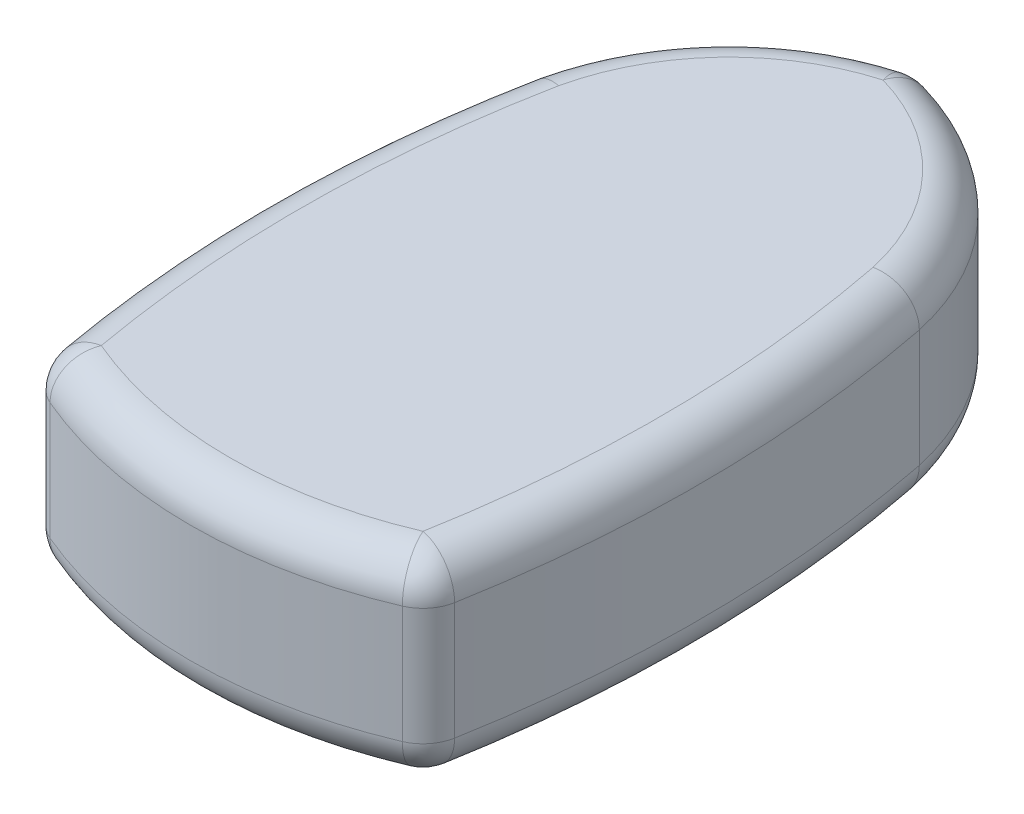
ISO-10303-21;
HEADER;
FILE_DESCRIPTION(('STEP AP214'),'2;1');
FILE_NAME('part.step','',(''),(''),'','','');
FILE_SCHEMA(('AUTOMOTIVE_DESIGN { 1 0 10303 214 1 1 1 1 }'));
ENDSEC;
DATA;
#1=APPLICATION_CONTEXT('core data for automotive mechanical design processes');
#2=APPLICATION_PROTOCOL_DEFINITION('international standard','automotive_design',2000,#1);
#3=PRODUCT_CONTEXT('',#1,'mechanical');
#4=PRODUCT('Part','Part','',(#3));
#5=PRODUCT_RELATED_PRODUCT_CATEGORY('part','',(#4));
#6=PRODUCT_DEFINITION_FORMATION('','',#4);
#7=PRODUCT_DEFINITION_CONTEXT('part definition',#1,'design');
#8=PRODUCT_DEFINITION('design','',#6,#7);
#9=PRODUCT_DEFINITION_SHAPE('','',#8);
#10=(LENGTH_UNIT() NAMED_UNIT(*) SI_UNIT(.MILLI.,.METRE.));
#11=(NAMED_UNIT(*) PLANE_ANGLE_UNIT() SI_UNIT($,.RADIAN.));
#12=(NAMED_UNIT(*) SI_UNIT($,.STERADIAN.) SOLID_ANGLE_UNIT());
#13=UNCERTAINTY_MEASURE_WITH_UNIT(LENGTH_MEASURE(1.E-05),#10,'distance_accuracy_value','');
#14=(GEOMETRIC_REPRESENTATION_CONTEXT(3) GLOBAL_UNCERTAINTY_ASSIGNED_CONTEXT((#13)) GLOBAL_UNIT_ASSIGNED_CONTEXT((#10,
#11,#12)) REPRESENTATION_CONTEXT('',''));
#15=CARTESIAN_POINT('',(0.,0.,0.));
#16=DIRECTION('',(0.,0.,1.));
#17=DIRECTION('',(1.,0.,0.));
#18=AXIS2_PLACEMENT_3D('',#15,#16,#17);
#19=CARTESIAN_POINT('',(25.4,25.4,-52.6092805501083));
#20=DIRECTION('',(0.,-1.,0.));
#21=DIRECTION('',(0.,0.,-1.));
#22=AXIS2_PLACEMENT_3D('',#19,#20,#21);
#23=CYLINDRICAL_SURFACE('',#22,58.42);
#24=CARTESIAN_POINT('',(25.4,5.08,-52.6092805501083));
#25=DIRECTION('',(0.,1.,0.));
#26=DIRECTION('',(0.,0.,1.));
#27=AXIS2_PLACEMENT_3D('',#24,#25,#26);
#28=CIRCLE('',#27,58.42);
#29=CARTESIAN_POINT('',(2.5161214205725,5.08,1.1422264163203));
#30=VERTEX_POINT('',#29);
#31=CARTESIAN_POINT('',(48.2838785794275,5.08,1.14222641632032));
#32=VERTEX_POINT('',#31);
#33=EDGE_CURVE('E224',#30,#32,#28,.T.);
#34=ORIENTED_EDGE('',*,*,#33,.T.);
#35=DIRECTION('',(0.,-1.,0.));
#36=VECTOR('',#35,1.);
#37=CARTESIAN_POINT('',(48.2838785794275,25.4,1.14222641632032));
#38=LINE('',#37,#36);
#39=CARTESIAN_POINT('',(48.2838785794275,20.32,1.14222641632032));
#40=VERTEX_POINT('',#39);
#41=EDGE_CURVE('E228',#32,#40,#38,.F.);
#42=ORIENTED_EDGE('',*,*,#41,.T.);
#43=CARTESIAN_POINT('',(25.4,20.32,-52.6092805501083));
#44=DIRECTION('',(0.,1.,0.));
#45=DIRECTION('',(0.,0.,1.));
#46=AXIS2_PLACEMENT_3D('',#43,#44,#45);
#47=CIRCLE('',#46,58.42);
#48=CARTESIAN_POINT('',(2.5161214205725,20.32,1.1422264163203));
#49=VERTEX_POINT('',#48);
#50=EDGE_CURVE('E221',#40,#49,#47,.F.);
#51=ORIENTED_EDGE('',*,*,#50,.T.);
#52=DIRECTION('',(0.,-1.,0.));
#53=VECTOR('',#52,1.);
#54=CARTESIAN_POINT('',(2.5161214205725,25.4,1.14222641632031));
#55=LINE('',#54,#53);
#56=EDGE_CURVE('E218',#49,#30,#55,.T.);
#57=ORIENTED_EDGE('',*,*,#56,.T.);
#58=EDGE_LOOP('',(#34,#42,#51,#57));
#59=FACE_BOUND('',#58,.T.);
#60=ADVANCED_FACE('F39',(#59),#23,.T.);
#61=CARTESIAN_POINT('',(-111.218355441598,25.4,-31.75));
#62=DIRECTION('',(0.,-1.,0.));
#63=DIRECTION('',(0.,0.,-1.));
#64=AXIS2_PLACEMENT_3D('',#61,#62,#63);
#65=CYLINDRICAL_SURFACE('',#64,165.1);
#66=DIRECTION('',(0.,-1.,0.));
#67=VECTOR('',#66,1.);
#68=CARTESIAN_POINT('',(51.2943675715887,25.4,-2.63600235558096));
#69=LINE('',#68,#67);
#70=CARTESIAN_POINT('',(51.2943675715887,20.32,-2.63600235558097));
#71=VERTEX_POINT('',#70);
#72=CARTESIAN_POINT('',(51.2943675715887,5.08,-2.63600235558097));
#73=VERTEX_POINT('',#72);
#74=EDGE_CURVE('E156',#71,#73,#69,.T.);
#75=ORIENTED_EDGE('',*,*,#74,.T.);
#76=CARTESIAN_POINT('',(-111.218355441598,5.08,-31.75));
#77=DIRECTION('',(0.,1.,0.));
#78=DIRECTION('',(0.,0.,1.));
#79=AXIS2_PLACEMENT_3D('',#76,#77,#78);
#80=CIRCLE('',#79,165.1);
#81=CARTESIAN_POINT('',(50.8,5.08,-63.5));
#82=VERTEX_POINT('',#81);
#83=EDGE_CURVE('E154',#73,#82,#80,.T.);
#84=ORIENTED_EDGE('',*,*,#83,.T.);
#85=DIRECTION('',(0.,-1.,0.));
#86=VECTOR('',#85,1.);
#87=CARTESIAN_POINT('',(50.8,25.4,-63.5));
#88=LINE('',#87,#86);
#89=CARTESIAN_POINT('',(50.8,20.32,-63.5));
#90=VERTEX_POINT('',#89);
#91=EDGE_CURVE('E137',#90,#82,#88,.T.);
#92=ORIENTED_EDGE('',*,*,#91,.F.);
#93=CARTESIAN_POINT('',(-111.218355441598,20.32,-31.75));
#94=DIRECTION('',(0.,1.,0.));
#95=DIRECTION('',(0.,0.,1.));
#96=AXIS2_PLACEMENT_3D('',#93,#94,#95);
#97=CIRCLE('',#96,165.1);
#98=EDGE_CURVE('E151',#90,#71,#97,.F.);
#99=ORIENTED_EDGE('',*,*,#98,.T.);
#100=EDGE_LOOP('',(#75,#84,#92,#99));
#101=FACE_BOUND('',#100,.T.);
#102=ADVANCED_FACE('F149',(#101),#65,.T.);
#103=CARTESIAN_POINT('',(17.3144267169768,25.4,-56.1162013903898));
#104=DIRECTION('',(0.,-1.,0.));
#105=DIRECTION('',(0.,0.,-1.));
#106=AXIS2_PLACEMENT_3D('',#103,#104,#105);
#107=CYLINDRICAL_SURFACE('',#106,34.29);
#108=ORIENTED_EDGE('',*,*,#91,.T.);
#109=CARTESIAN_POINT('',(17.3144267169768,5.08,-56.1162013903898));
#110=DIRECTION('',(0.,1.,0.));
#111=DIRECTION('',(0.,0.,1.));
#112=AXIS2_PLACEMENT_3D('',#109,#110,#111);
#113=CIRCLE('',#112,34.29);
#114=CARTESIAN_POINT('',(26.8061866579171,5.08,-89.0663242008372));
#115=VERTEX_POINT('',#114);
#116=EDGE_CURVE('E145',#82,#115,#113,.T.);
#117=ORIENTED_EDGE('',*,*,#116,.T.);
#118=DIRECTION('',(0.,-1.,0.));
#119=VECTOR('',#118,1.);
#120=CARTESIAN_POINT('',(26.8061866579171,25.4,-89.0663242008372));
#121=LINE('',#120,#119);
#122=CARTESIAN_POINT('',(26.8061866579171,20.32,-89.0663242008372));
#123=VERTEX_POINT('',#122);
#124=EDGE_CURVE('E139',#115,#123,#121,.F.);
#125=ORIENTED_EDGE('',*,*,#124,.T.);
#126=CARTESIAN_POINT('',(17.3144267169768,20.32,-56.1162013903898));
#127=DIRECTION('',(0.,1.,0.));
#128=DIRECTION('',(0.,0.,1.));
#129=AXIS2_PLACEMENT_3D('',#126,#127,#128);
#130=CIRCLE('',#129,34.29);
#131=EDGE_CURVE('E134',#123,#90,#130,.F.);
#132=ORIENTED_EDGE('',*,*,#131,.T.);
#133=EDGE_LOOP('',(#108,#117,#125,#132));
#134=FACE_BOUND('',#133,.T.);
#135=ADVANCED_FACE('F136',(#134),#107,.T.);
#136=CARTESIAN_POINT('',(33.4855732830232,25.4,-56.1162013903898));
#137=DIRECTION('',(0.,-1.,0.));
#138=DIRECTION('',(0.,0.,-1.));
#139=AXIS2_PLACEMENT_3D('',#136,#137,#138);
#140=CYLINDRICAL_SURFACE('',#139,34.29);
#141=DIRECTION('',(0.,-1.,0.));
#142=VECTOR('',#141,1.);
#143=CARTESIAN_POINT('',(23.9938133420829,25.4,-89.0663242008372));
#144=LINE('',#143,#142);
#145=CARTESIAN_POINT('',(23.9938133420829,20.32,-89.0663242008372));
#146=VERTEX_POINT('',#145);
#147=CARTESIAN_POINT('',(23.9938133420829,5.08,-89.0663242008372));
#148=VERTEX_POINT('',#147);
#149=EDGE_CURVE('E199',#146,#148,#144,.T.);
#150=ORIENTED_EDGE('',*,*,#149,.T.);
#151=CARTESIAN_POINT('',(33.4855732830232,5.08,-56.1162013903898));
#152=DIRECTION('',(0.,1.,0.));
#153=DIRECTION('',(0.,0.,1.));
#154=AXIS2_PLACEMENT_3D('',#151,#152,#153);
#155=CIRCLE('',#154,34.29);
#156=CARTESIAN_POINT('',(0.,5.08,-63.4999999999999));
#157=VERTEX_POINT('',#156);
#158=EDGE_CURVE('E205',#148,#157,#155,.T.);
#159=ORIENTED_EDGE('',*,*,#158,.T.);
#160=DIRECTION('',(0.,-1.,0.));
#161=VECTOR('',#160,1.);
#162=CARTESIAN_POINT('',(0.,25.4,-63.4999999999999));
#163=LINE('',#162,#161);
#164=CARTESIAN_POINT('',(0.,20.32,-63.4999999999999));
#165=VERTEX_POINT('',#164);
#166=EDGE_CURVE('E157',#165,#157,#163,.T.);
#167=ORIENTED_EDGE('',*,*,#166,.F.);
#168=CARTESIAN_POINT('',(33.4855732830232,20.32,-56.1162013903898));
#169=DIRECTION('',(0.,1.,0.));
#170=DIRECTION('',(0.,0.,1.));
#171=AXIS2_PLACEMENT_3D('',#168,#169,#170);
#172=CIRCLE('',#171,34.29);
#173=EDGE_CURVE('E202',#165,#146,#172,.F.);
#174=ORIENTED_EDGE('',*,*,#173,.T.);
#175=EDGE_LOOP('',(#150,#159,#167,#174));
#176=FACE_BOUND('',#175,.T.);
#177=ADVANCED_FACE('F426',(#176),#140,.T.);
#178=CARTESIAN_POINT('',(162.018355441598,25.4,-31.75));
#179=DIRECTION('',(0.,-1.,0.));
#180=DIRECTION('',(0.,0.,-1.));
#181=AXIS2_PLACEMENT_3D('',#178,#179,#180);
#182=CYLINDRICAL_SURFACE('',#181,165.1);
#183=ORIENTED_EDGE('',*,*,#166,.T.);
#184=CARTESIAN_POINT('',(162.018355441598,5.08,-31.75));
#185=DIRECTION('',(0.,1.,0.));
#186=DIRECTION('',(0.,0.,1.));
#187=AXIS2_PLACEMENT_3D('',#184,#185,#186);
#188=CIRCLE('',#187,165.1);
#189=CARTESIAN_POINT('',(-0.494367571588713,5.08,-2.63600235558099));
#190=VERTEX_POINT('',#189);
#191=EDGE_CURVE('E215',#157,#190,#188,.T.);
#192=ORIENTED_EDGE('',*,*,#191,.T.);
#193=DIRECTION('',(0.,-1.,0.));
#194=VECTOR('',#193,1.);
#195=CARTESIAN_POINT('',(-0.494367571588744,25.4,-2.63600235558099));
#196=LINE('',#195,#194);
#197=CARTESIAN_POINT('',(-0.494367571588713,20.32,-2.63600235558099));
#198=VERTEX_POINT('',#197);
#199=EDGE_CURVE('E209',#190,#198,#196,.F.);
#200=ORIENTED_EDGE('',*,*,#199,.T.);
#201=CARTESIAN_POINT('',(162.018355441598,20.32,-31.75));
#202=DIRECTION('',(0.,1.,0.));
#203=DIRECTION('',(0.,0.,1.));
#204=AXIS2_PLACEMENT_3D('',#201,#202,#203);
#205=CIRCLE('',#204,165.1);
#206=EDGE_CURVE('E212',#198,#165,#205,.F.);
#207=ORIENTED_EDGE('',*,*,#206,.T.);
#208=EDGE_LOOP('',(#183,#192,#200,#207));
#209=FACE_BOUND('',#208,.T.);
#210=ADVANCED_FACE('F429',(#209),#182,.T.);
#211=CARTESIAN_POINT('',(-42.909177720799,25.4,-42.1796402750541));
#212=DIRECTION('',(0.,1.,0.));
#213=DIRECTION('',(0.,0.,1.));
#214=AXIS2_PLACEMENT_3D('',#211,#212,#213);
#215=PLANE('',#214);
#216=CARTESIAN_POINT('',(33.4855732830232,25.4,-56.1162013903898));
#217=DIRECTION('',(0.,1.,0.));
#218=DIRECTION('',(0.,0.,1.));
#219=AXIS2_PLACEMENT_3D('',#216,#217,#218);
#220=CIRCLE('',#219,29.21);
#221=CARTESIAN_POINT('',(25.4,25.4,-84.1848245252153));
#222=VERTEX_POINT('',#221);
#223=CARTESIAN_POINT('',(4.97333168382862,25.4,-62.4625530186213));
#224=VERTEX_POINT('',#223);
#225=EDGE_CURVE('E49',#222,#224,#220,.T.);
#226=ORIENTED_EDGE('',*,*,#225,.T.);
#227=CARTESIAN_POINT('',(162.018355441598,25.4,-31.75));
#228=DIRECTION('',(0.,1.,0.));
#229=DIRECTION('',(0.,0.,1.));
#230=AXIS2_PLACEMENT_3D('',#227,#228,#229);
#231=CIRCLE('',#230,160.02);
#232=CARTESIAN_POINT('',(4.50602390574011,25.4,-3.53181766771696));
#233=VERTEX_POINT('',#232);
#234=EDGE_CURVE('E11',#224,#233,#231,.T.);
#235=ORIENTED_EDGE('',*,*,#234,.T.);
#236=CARTESIAN_POINT('',(25.4,25.4,-52.6092805501083));
#237=DIRECTION('',(0.,1.,0.));
#238=DIRECTION('',(0.,0.,1.));
#239=AXIS2_PLACEMENT_3D('',#236,#237,#238);
#240=CIRCLE('',#239,53.34);
#241=CARTESIAN_POINT('',(46.2939760942599,25.4,-3.53181766771697));
#242=VERTEX_POINT('',#241);
#243=EDGE_CURVE('E231',#233,#242,#240,.T.);
#244=ORIENTED_EDGE('',*,*,#243,.T.);
#245=CARTESIAN_POINT('',(-111.218355441598,25.4,-31.75));
#246=DIRECTION('',(0.,1.,0.));
#247=DIRECTION('',(0.,0.,1.));
#248=AXIS2_PLACEMENT_3D('',#245,#246,#247);
#249=CIRCLE('',#248,160.02);
#250=CARTESIAN_POINT('',(45.8266683161713,25.4,-62.4625530186218));
#251=VERTEX_POINT('',#250);
#252=EDGE_CURVE('E234',#242,#251,#249,.T.);
#253=ORIENTED_EDGE('',*,*,#252,.T.);
#254=CARTESIAN_POINT('',(17.3144267169768,25.4,-56.1162013903898));
#255=DIRECTION('',(0.,1.,0.));
#256=DIRECTION('',(0.,0.,1.));
#257=AXIS2_PLACEMENT_3D('',#254,#255,#256);
#258=CIRCLE('',#257,29.21);
#259=EDGE_CURVE('E60',#251,#222,#258,.T.);
#260=ORIENTED_EDGE('',*,*,#259,.T.);
#261=EDGE_LOOP('',(#226,#235,#244,#253,#260));
#262=FACE_BOUND('',#261,.T.);
#263=ADVANCED_FACE('F455',(#262),#215,.T.);
#264=CARTESIAN_POINT('',(-42.909177720799,0.,-42.1796402750541));
#265=DIRECTION('',(0.,1.,0.));
#266=DIRECTION('',(0.,0.,1.));
#267=AXIS2_PLACEMENT_3D('',#264,#265,#266);
#268=PLANE('',#267);
#269=CARTESIAN_POINT('',(17.3144267169768,0.,-56.1162013903898));
#270=DIRECTION('',(0.,1.,0.));
#271=DIRECTION('',(0.,0.,1.));
#272=AXIS2_PLACEMENT_3D('',#269,#270,#271);
#273=CIRCLE('',#272,29.21);
#274=CARTESIAN_POINT('',(25.4,0.,-84.1848245252153));
#275=VERTEX_POINT('',#274);
#276=CARTESIAN_POINT('',(45.8266683161713,0.,-62.4625530186217));
#277=VERTEX_POINT('',#276);
#278=EDGE_CURVE('E188',#275,#277,#273,.F.);
#279=ORIENTED_EDGE('',*,*,#278,.T.);
#280=CARTESIAN_POINT('',(-111.218355441598,0.,-31.75));
#281=DIRECTION('',(0.,1.,0.));
#282=DIRECTION('',(0.,0.,1.));
#283=AXIS2_PLACEMENT_3D('',#280,#281,#282);
#284=CIRCLE('',#283,160.02);
#285=CARTESIAN_POINT('',(46.2939760942599,0.,-3.53181766771697));
#286=VERTEX_POINT('',#285);
#287=EDGE_CURVE('E191',#277,#286,#284,.F.);
#288=ORIENTED_EDGE('',*,*,#287,.T.);
#289=CARTESIAN_POINT('',(25.4,0.,-52.6092805501083));
#290=DIRECTION('',(0.,1.,0.));
#291=DIRECTION('',(0.,0.,1.));
#292=AXIS2_PLACEMENT_3D('',#289,#290,#291);
#293=CIRCLE('',#292,53.34);
#294=CARTESIAN_POINT('',(4.50602390574011,0.,-3.53181766771696));
#295=VERTEX_POINT('',#294);
#296=EDGE_CURVE('E176',#286,#295,#293,.F.);
#297=ORIENTED_EDGE('',*,*,#296,.T.);
#298=CARTESIAN_POINT('',(162.018355441598,0.,-31.75));
#299=DIRECTION('',(0.,1.,0.));
#300=DIRECTION('',(0.,0.,1.));
#301=AXIS2_PLACEMENT_3D('',#298,#299,#300);
#302=CIRCLE('',#301,160.02);
#303=CARTESIAN_POINT('',(4.97333168382855,0.,-62.4625530186211));
#304=VERTEX_POINT('',#303);
#305=EDGE_CURVE('E182',#295,#304,#302,.F.);
#306=ORIENTED_EDGE('',*,*,#305,.T.);
#307=CARTESIAN_POINT('',(33.4855732830232,0.,-56.1162013903898));
#308=DIRECTION('',(0.,1.,0.));
#309=DIRECTION('',(0.,0.,1.));
#310=AXIS2_PLACEMENT_3D('',#307,#308,#309);
#311=CIRCLE('',#310,29.21);
#312=EDGE_CURVE('E185',#304,#275,#311,.F.);
#313=ORIENTED_EDGE('',*,*,#312,.T.);
#314=EDGE_LOOP('',(#279,#288,#297,#306,#313));
#315=FACE_BOUND('',#314,.T.);
#316=ADVANCED_FACE('F411',(#315),#268,.F.);
#317=CARTESIAN_POINT('',(162.018355441598,20.32,-31.75));
#318=DIRECTION('',(0.,1.,0.));
#319=DIRECTION('',(0.,0.,1.));
#320=AXIS2_PLACEMENT_3D('',#317,#318,#319);
#321=TOROIDAL_SURFACE('',#320,160.02,5.08);
#322=CARTESIAN_POINT('',(4.5060239057401,20.32,-3.53181766771694));
#323=DIRECTION('',(0.176341596877156,0.,0.984329030970241));
#324=DIRECTION('',(0.984329030970242,0.,-0.176341596877156));
#325=AXIS2_PLACEMENT_3D('',#322,#323,#324);
#326=CIRCLE('',#325,5.08);
#327=EDGE_CURVE('E43',#233,#198,#326,.T.);
#328=ORIENTED_EDGE('',*,*,#327,.F.);
#329=ORIENTED_EDGE('',*,*,#234,.F.);
#330=CARTESIAN_POINT('',(0.,20.32,-63.4999999999999));
#331=CARTESIAN_POINT('',(-1.50508630477774E-05,20.4628681093777,-63.5000031013171));
#332=CARTESIAN_POINT('',(0.00590019973921946,20.6057340061103,-63.4987715412028));
#333=CARTESIAN_POINT('',(0.0294825950954693,20.8904436644747,-63.4938614994589));
#334=CARTESIAN_POINT('',(0.0471491761554455,21.0322874748047,-63.490183135199));
#335=CARTESIAN_POINT('',(0.0941093547436546,21.3138520881607,-63.480405253186));
#336=CARTESIAN_POINT('',(0.123394930451582,21.4535742870028,-63.4743074058575));
#337=CARTESIAN_POINT('',(0.193379864353173,21.7300017297115,-63.4597345042007));
#338=CARTESIAN_POINT('',(0.234079083806526,21.866707010229,-63.4512594787684));
#339=CARTESIAN_POINT('',(0.326617220921296,22.1361714427967,-63.4319886879443));
#340=CARTESIAN_POINT('',(0.378459470456608,22.2689294010142,-63.4211922284208));
#341=CARTESIAN_POINT('',(0.492928468384816,22.5295608896241,-63.3973517765342));
#342=CARTESIAN_POINT('',(0.555559181863877,22.657432602987,-63.3843069578303));
#343=CARTESIAN_POINT('',(0.691105737597948,22.9072558519563,-63.356072893054));
#344=CARTESIAN_POINT('',(0.764015430735183,23.0292108688594,-63.3408849290547));
#345=CARTESIAN_POINT('',(0.919656781250289,23.2664571513926,-63.308460036234));
#346=CARTESIAN_POINT('',(1.00239184312959,23.3817460865228,-63.2912223971953));
#347=CARTESIAN_POINT('',(1.17705785537819,23.6047727241403,-63.2548274705111));
#348=CARTESIAN_POINT('',(1.26898699047674,23.7125119101285,-63.2356705618035));
#349=CARTESIAN_POINT('',(1.46140106780738,23.9196985539233,-63.1955692844729));
#350=CARTESIAN_POINT('',(1.561886011667,24.0191460101526,-63.1746249155098));
#351=CARTESIAN_POINT('',(1.770751257801,24.2090917434299,-63.1310851281759));
#352=CARTESIAN_POINT('',(1.87913561108637,24.2995853718537,-63.1084888626536));
#353=CARTESIAN_POINT('',(2.10294346514759,24.4708917302356,-63.0618225120339));
#354=CARTESIAN_POINT('',(2.21836450945542,24.5517078096958,-63.0377529412471));
#355=CARTESIAN_POINT('',(2.45554364988205,24.7031753200946,-62.9882851364756));
#356=CARTESIAN_POINT('',(2.57730620081242,24.7738194705982,-62.9628859684031));
#357=CARTESIAN_POINT('',(2.82617961739735,24.9043479216716,-62.9109639845646));
#358=CARTESIAN_POINT('',(2.95328851054019,24.9642361483579,-62.8844415831867));
#359=CARTESIAN_POINT('',(3.21191822415916,25.0728273885908,-62.8304673814588));
#360=CARTESIAN_POINT('',(3.34343642781593,25.1215369063269,-62.8030161322711));
#361=CARTESIAN_POINT('',(3.60997239429116,25.207455139403,-62.7473736475067));
#362=CARTESIAN_POINT('',(3.7449890642059,25.2446674005806,-62.7191826429918));
#363=CARTESIAN_POINT('',(4.04633776773557,25.3139527792338,-62.656250833283));
#364=CARTESIAN_POINT('',(4.21327633145382,25.3432929968408,-62.6213810146391));
#365=CARTESIAN_POINT('',(4.5489931198223,25.3844118547317,-62.5512412040614));
#366=CARTESIAN_POINT('',(4.71776820432498,25.3962168090206,-62.5159718919325));
#367=CARTESIAN_POINT('',(4.91551116271874,25.399742856543,-62.4746394511336));
#368=CARTESIAN_POINT('',(4.94442305094332,25.4000005008413,-62.4685960164859));
#369=CARTESIAN_POINT('',(4.97333168382835,25.4,-62.4625530186205));
#370=B_SPLINE_CURVE_WITH_KNOTS('',3,(#330,#331,#332,#333,#334,#335,#336,#337,#338,#339,#340,
#341,#342,#343,#344,#345,#346,#347,#348,#349,#350,#351,#352,#353,#354,#355,#356,#357,#358,#359,
#360,#361,#362,#363,#364,#365,#366,#367,#368,#369),.UNSPECIFIED.,.F.,.F.,(4,2,2,2,2,2,2,2,2,2,2,
2,2,2,2,2,2,2,2,4),(0.,0.428473497435329,0.856926443110384,1.28508409574292,1.7132365440645,
2.14151719265175,2.56995558446932,2.99813875381967,3.42647072440944,3.85471829179319,
4.28296594063985,4.71143477197472,5.13975487443328,5.56838003397318,5.99684841778732,
6.42506686708905,6.85315311857462,7.37139730877467,7.8888630158965,7.97747162145596),.UNSPECIFIED.);
#371=EDGE_CURVE('E347',#165,#224,#370,.T.);
#372=ORIENTED_EDGE('',*,*,#371,.F.);
#373=ORIENTED_EDGE('',*,*,#206,.F.);
#374=EDGE_LOOP('',(#328,#329,#372,#373));
#375=FACE_BOUND('',#374,.T.);
#376=ADVANCED_FACE('F345',(#375),#321,.T.);
#377=CARTESIAN_POINT('',(4.50602390574011,20.32,-3.53181766771696));
#378=DIRECTION('',(0.,0.,1.));
#379=DIRECTION('',(1.,0.,0.));
#380=AXIS2_PLACEMENT_3D('',#377,#378,#379);
#381=SPHERICAL_SURFACE('',#380,5.08);
#382=CARTESIAN_POINT('',(4.50602390574011,20.32,-3.53181766771696));
#383=DIRECTION('',(-0.920087418117572,0.,-0.391713087631419));
#384=DIRECTION('',(-0.391713087631419,0.,0.920087418117572));
#385=AXIS2_PLACEMENT_3D('',#382,#383,#384);
#386=CIRCLE('',#385,5.08);
#387=EDGE_CURVE('E165',#233,#49,#386,.F.);
#388=ORIENTED_EDGE('',*,*,#387,.F.);
#389=ORIENTED_EDGE('',*,*,#327,.T.);
#390=CARTESIAN_POINT('',(4.50602390574011,20.32,-3.53181766771696));
#391=DIRECTION('',(0.,1.,0.));
#392=DIRECTION('',(0.,0.,1.));
#393=AXIS2_PLACEMENT_3D('',#390,#391,#392);
#394=CIRCLE('',#393,5.08);
#395=EDGE_CURVE('E354',#49,#198,#394,.F.);
#396=ORIENTED_EDGE('',*,*,#395,.F.);
#397=EDGE_LOOP('',(#388,#389,#396));
#398=FACE_BOUND('',#397,.T.);
#399=ADVANCED_FACE('F41',(#398),#381,.T.);
#400=CARTESIAN_POINT('',(17.3144267169768,20.32,-56.1162013903898));
#401=DIRECTION('',(0.,1.,0.));
#402=DIRECTION('',(0.,0.,1.));
#403=AXIS2_PLACEMENT_3D('',#400,#401,#402);
#404=TOROIDAL_SURFACE('',#403,29.21,5.08);
#405=CARTESIAN_POINT('',(25.4,20.32,-84.1848245252153));
#406=DIRECTION('',(-0.960925132996422,0.,-0.276808397227774));
#407=DIRECTION('',(-0.276808397227774,0.,0.960925132996422));
#408=AXIS2_PLACEMENT_3D('',#405,#406,#407);
#409=CIRCLE('',#408,5.08);
#410=EDGE_CURVE('E166',#222,#123,#409,.T.);
#411=ORIENTED_EDGE('',*,*,#410,.F.);
#412=ORIENTED_EDGE('',*,*,#259,.F.);
#413=CARTESIAN_POINT('',(50.8,20.32,-63.5));
#414=CARTESIAN_POINT('',(50.8000150508631,20.4628681093777,-63.5000031013169));
#415=CARTESIAN_POINT('',(50.7940998002608,20.6057340061103,-63.4987715412025));
#416=CARTESIAN_POINT('',(50.7705174049046,20.8904436644747,-63.4938614994588));
#417=CARTESIAN_POINT('',(50.7528508238446,21.0322874748047,-63.490183135199));
#418=CARTESIAN_POINT('',(50.7058906452564,21.3138520881607,-63.4804052531854));
#419=CARTESIAN_POINT('',(50.6766050695486,21.4535742870028,-63.4743074058564));
#420=CARTESIAN_POINT('',(50.606620135647,21.7300017297115,-63.4597345042));
#421=CARTESIAN_POINT('',(50.5659209161934,21.866707010229,-63.4512594787687));
#422=CARTESIAN_POINT('',(50.4733827790784,22.1361714427967,-63.4319886879459));
#423=CARTESIAN_POINT('',(50.421540529543,22.2689294010142,-63.4211922284226));
#424=CARTESIAN_POINT('',(50.3070715316149,22.5295608896241,-63.3973517765355));
#425=CARTESIAN_POINT('',(50.244440818136,22.657432602987,-63.3843069578306));
#426=CARTESIAN_POINT('',(50.1088942624023,22.9072558519563,-63.3560728930529));
#427=CARTESIAN_POINT('',(50.0359845692652,23.0292108688594,-63.3408849290531));
#428=CARTESIAN_POINT('',(49.8803432187499,23.2664571513926,-63.3084600362331));
#429=CARTESIAN_POINT('',(49.7976081568703,23.3817460865228,-63.2912223971956));
#430=CARTESIAN_POINT('',(49.6229421446215,23.6047727241403,-63.2548274705124));
#431=CARTESIAN_POINT('',(49.5310130095231,23.7125119101285,-63.2356705618045));
#432=CARTESIAN_POINT('',(49.3385989321925,23.9196985539232,-63.1955692844734));
#433=CARTESIAN_POINT('',(49.2381139883329,24.0191460101526,-63.1746249155103));
#434=CARTESIAN_POINT('',(49.0292487421989,24.2090917434299,-63.1310851281763));
#435=CARTESIAN_POINT('',(48.9208643889135,24.2995853718537,-63.1084888626541));
#436=CARTESIAN_POINT('',(48.6970565348524,24.4708917302355,-63.0618225120338));
#437=CARTESIAN_POINT('',(48.5816354905448,24.5517078096958,-63.0377529412463));
#438=CARTESIAN_POINT('',(48.344456350118,24.7031753200946,-62.9882851364754));
#439=CARTESIAN_POINT('',(48.2226937991874,24.7738194705982,-62.9628859684041));
#440=CARTESIAN_POINT('',(47.9738203826024,24.9043479216716,-62.910963984566));
#441=CARTESIAN_POINT('',(47.8467114894597,24.9642361483579,-62.8844415831872));
#442=CARTESIAN_POINT('',(47.5880817758408,25.0728273885908,-62.830467381459));
#443=CARTESIAN_POINT('',(47.4565635721839,25.1215369063269,-62.8030161322718));
#444=CARTESIAN_POINT('',(47.1900276057086,25.207455139403,-62.7473736475081));
#445=CARTESIAN_POINT('',(47.0550109357938,25.2446674005806,-62.7191826429933));
#446=CARTESIAN_POINT('',(46.7536622322642,25.3139527792338,-62.6562508332841));
#447=CARTESIAN_POINT('',(46.5867236685461,25.3432929968408,-62.6213810146392));
#448=CARTESIAN_POINT('',(46.2510068801782,25.3844118547317,-62.551241204059));
#449=CARTESIAN_POINT('',(46.0822317956758,25.3962168090206,-62.5159718919285));
#450=CARTESIAN_POINT('',(45.8844888372816,25.399742856543,-62.4746394511318));
#451=CARTESIAN_POINT('',(45.8555769490569,25.4000005008413,-62.4685960164846));
#452=CARTESIAN_POINT('',(45.8266683161718,25.4,-62.4625530186198));
#453=B_SPLINE_CURVE_WITH_KNOTS('',3,(#413,#414,#415,#416,#417,#418,#419,#420,#421,#422,#423,
#424,#425,#426,#427,#428,#429,#430,#431,#432,#433,#434,#435,#436,#437,#438,#439,#440,#441,#442,
#443,#444,#445,#446,#447,#448,#449,#450,#451,#452),.UNSPECIFIED.,.F.,.F.,(4,2,2,2,2,2,2,2,2,2,2,
2,2,2,2,2,2,2,2,4),(0.,0.42847349743533,0.856926443110382,1.28508409574292,1.7132365440645,
2.14151719265175,2.56995558446932,2.99813875381968,3.42647072440944,3.85471829179319,
4.28296594063984,4.71143477197471,5.13975487443326,5.56838003397318,5.99684841778732,
6.42506686708905,6.85315311857461,7.37139730877467,7.88886301589653,7.97747162145598),.UNSPECIFIED.);
#454=EDGE_CURVE('E160',#90,#251,#453,.T.);
#455=ORIENTED_EDGE('',*,*,#454,.F.);
#456=ORIENTED_EDGE('',*,*,#131,.F.);
#457=EDGE_LOOP('',(#411,#412,#455,#456));
#458=FACE_BOUND('',#457,.T.);
#459=ADVANCED_FACE('F161',(#458),#404,.T.);
#460=CARTESIAN_POINT('',(33.4855732830232,20.32,-56.1162013903898));
#461=DIRECTION('',(0.,1.,0.));
#462=DIRECTION('',(0.,0.,1.));
#463=AXIS2_PLACEMENT_3D('',#460,#461,#462);
#464=TOROIDAL_SURFACE('',#463,29.21,5.08);
#465=ORIENTED_EDGE('',*,*,#371,.T.);
#466=ORIENTED_EDGE('',*,*,#225,.F.);
#467=CARTESIAN_POINT('',(25.4,20.32,-84.1848245252153));
#468=DIRECTION('',(0.960925132996422,0.,-0.276808397227772));
#469=DIRECTION('',(-0.276808397227772,0.,-0.960925132996422));
#470=AXIS2_PLACEMENT_3D('',#467,#468,#469);
#471=CIRCLE('',#470,5.08);
#472=EDGE_CURVE('E315',#146,#222,#471,.T.);
#473=ORIENTED_EDGE('',*,*,#472,.F.);
#474=ORIENTED_EDGE('',*,*,#173,.F.);
#475=EDGE_LOOP('',(#465,#466,#473,#474));
#476=FACE_BOUND('',#475,.T.);
#477=ADVANCED_FACE('F333',(#476),#464,.T.);
#478=CARTESIAN_POINT('',(4.50602390574011,25.4,-3.53181766771696));
#479=DIRECTION('',(0.,-1.,0.));
#480=DIRECTION('',(0.,0.,-1.));
#481=AXIS2_PLACEMENT_3D('',#478,#479,#480);
#482=CYLINDRICAL_SURFACE('',#481,5.08);
#483=ORIENTED_EDGE('',*,*,#395,.T.);
#484=ORIENTED_EDGE('',*,*,#199,.F.);
#485=CARTESIAN_POINT('',(4.50602390574011,5.08,-3.53181766771696));
#486=DIRECTION('',(0.,-1.,0.));
#487=DIRECTION('',(0.,0.,-1.));
#488=AXIS2_PLACEMENT_3D('',#485,#486,#487);
#489=CIRCLE('',#488,5.08);
#490=EDGE_CURVE('E307',#30,#190,#489,.T.);
#491=ORIENTED_EDGE('',*,*,#490,.F.);
#492=ORIENTED_EDGE('',*,*,#56,.F.);
#493=EDGE_LOOP('',(#483,#484,#491,#492));
#494=FACE_BOUND('',#493,.T.);
#495=ADVANCED_FACE('F337',(#494),#482,.T.);
#496=CARTESIAN_POINT('',(25.4,20.32,-52.6092805501083));
#497=DIRECTION('',(0.,1.,0.));
#498=DIRECTION('',(0.,0.,1.));
#499=AXIS2_PLACEMENT_3D('',#496,#497,#498);
#500=TOROIDAL_SURFACE('',#499,53.34,5.08);
#501=ORIENTED_EDGE('',*,*,#387,.T.);
#502=ORIENTED_EDGE('',*,*,#50,.F.);
#503=CARTESIAN_POINT('',(46.2939760942599,20.32,-3.53181766771697));
#504=DIRECTION('',(0.920087418117575,0.,-0.391713087631412));
#505=DIRECTION('',(-0.391713087631412,0.,-0.920087418117575));
#506=AXIS2_PLACEMENT_3D('',#503,#504,#505);
#507=CIRCLE('',#506,5.08);
#508=EDGE_CURVE('E303',#242,#40,#507,.T.);
#509=ORIENTED_EDGE('',*,*,#508,.F.);
#510=ORIENTED_EDGE('',*,*,#243,.F.);
#511=EDGE_LOOP('',(#501,#502,#509,#510));
#512=FACE_BOUND('',#511,.T.);
#513=ADVANCED_FACE('F334',(#512),#500,.T.);
#514=CARTESIAN_POINT('',(-111.218355441598,20.32,-31.75));
#515=DIRECTION('',(0.,1.,0.));
#516=DIRECTION('',(0.,0.,1.));
#517=AXIS2_PLACEMENT_3D('',#514,#515,#516);
#518=TOROIDAL_SURFACE('',#517,160.02,5.08);
#519=ORIENTED_EDGE('',*,*,#454,.T.);
#520=ORIENTED_EDGE('',*,*,#252,.F.);
#521=CARTESIAN_POINT('',(46.2939760942599,20.32,-3.53181766771694));
#522=DIRECTION('',(-0.17634159687716,0.,0.984329030970241));
#523=DIRECTION('',(0.984329030970241,0.,0.17634159687716));
#524=AXIS2_PLACEMENT_3D('',#521,#522,#523);
#525=CIRCLE('',#524,5.08);
#526=EDGE_CURVE('E170',#71,#242,#525,.T.);
#527=ORIENTED_EDGE('',*,*,#526,.F.);
#528=ORIENTED_EDGE('',*,*,#98,.F.);
#529=EDGE_LOOP('',(#519,#520,#527,#528));
#530=FACE_BOUND('',#529,.T.);
#531=ADVANCED_FACE('F168',(#530),#518,.T.);
#532=CARTESIAN_POINT('',(25.4,20.32,-84.1848245252153));
#533=DIRECTION('',(0.,0.,1.));
#534=DIRECTION('',(1.,0.,0.));
#535=AXIS2_PLACEMENT_3D('',#532,#533,#534);
#536=SPHERICAL_SURFACE('',#535,5.08);
#537=ORIENTED_EDGE('',*,*,#472,.T.);
#538=ORIENTED_EDGE('',*,*,#410,.T.);
#539=CARTESIAN_POINT('',(25.4,20.32,-84.1848245252153));
#540=DIRECTION('',(0.,1.,0.));
#541=DIRECTION('',(0.,0.,1.));
#542=AXIS2_PLACEMENT_3D('',#539,#540,#541);
#543=CIRCLE('',#542,5.08);
#544=EDGE_CURVE('E295',#146,#123,#543,.F.);
#545=ORIENTED_EDGE('',*,*,#544,.F.);
#546=EDGE_LOOP('',(#537,#538,#545));
#547=FACE_BOUND('',#546,.T.);
#548=ADVANCED_FACE('F282',(#547),#536,.T.);
#549=CARTESIAN_POINT('',(162.018355441598,5.08,-31.75));
#550=DIRECTION('',(0.,1.,0.));
#551=DIRECTION('',(0.,0.,1.));
#552=AXIS2_PLACEMENT_3D('',#549,#550,#551);
#553=TOROIDAL_SURFACE('',#552,160.02,5.08);
#554=CARTESIAN_POINT('',(4.50602390574011,5.08,-3.53181766771696));
#555=DIRECTION('',(0.176341596877159,0.,0.984329030970241));
#556=DIRECTION('',(0.984329030970241,0.,-0.176341596877159));
#557=AXIS2_PLACEMENT_3D('',#554,#555,#556);
#558=CIRCLE('',#557,5.08);
#559=EDGE_CURVE('E311',#190,#295,#558,.T.);
#560=ORIENTED_EDGE('',*,*,#559,.F.);
#561=ORIENTED_EDGE('',*,*,#191,.F.);
#562=CARTESIAN_POINT('',(0.,5.08,-63.4999999999999));
#563=CARTESIAN_POINT('',(-1.50508629496443E-05,4.93713189062225,-63.5000031013176));
#564=CARTESIAN_POINT('',(0.00590019973941704,4.79426599388971,-63.4987715412037));
#565=CARTESIAN_POINT('',(0.0294825950957639,4.50955633552527,-63.4938614994603));
#566=CARTESIAN_POINT('',(0.0471491761557374,4.36771252519528,-63.4901831352004));
#567=CARTESIAN_POINT('',(0.0941093547437357,4.08614791183925,-63.4804052531863));
#568=CARTESIAN_POINT('',(0.123394930451455,3.94642571299718,-63.4743074058569));
#569=CARTESIAN_POINT('',(0.193379864352964,3.66999827028845,-63.4597345041997));
#570=CARTESIAN_POINT('',(0.234079083806441,3.53329298977096,-63.451259478768));
#571=CARTESIAN_POINT('',(0.326617220921387,3.26382855720333,-63.4319886879447));
#572=CARTESIAN_POINT('',(0.378459470456751,3.13107059898583,-63.4211922284214));
#573=CARTESIAN_POINT('',(0.492928468384944,2.87043911037585,-63.3973517765348));
#574=CARTESIAN_POINT('',(0.555559181863937,2.74256739701296,-63.3843069578306));
#575=CARTESIAN_POINT('',(0.691105737597947,2.49274414804366,-63.356072893054));
#576=CARTESIAN_POINT('',(0.76401543073519,2.37078913114062,-63.3408849290547));
#577=CARTESIAN_POINT('',(0.919656781250338,2.1335428486074,-63.3084600362343));
#578=CARTESIAN_POINT('',(1.00239184312968,2.01825391347721,-63.2912223971957));
#579=CARTESIAN_POINT('',(1.1770578553783,1.79522727585965,-63.2548274705116));
#580=CARTESIAN_POINT('',(1.26898699047682,1.68748808987155,-63.2356705618039));
#581=CARTESIAN_POINT('',(1.46140106780748,1.48030144607675,-63.1955692844733));
#582=CARTESIAN_POINT('',(1.56188601166713,1.38085398984735,-63.1746249155105));
#583=CARTESIAN_POINT('',(1.77075125780105,1.19090825657014,-63.1310851281762));
#584=CARTESIAN_POINT('',(1.87913561108631,1.1004146281463,-63.1084888626534));
#585=CARTESIAN_POINT('',(2.10294346514738,0.929108269764446,-63.061822512033));
#586=CARTESIAN_POINT('',(2.21836450945516,0.848292190304221,-63.037752941246));
#587=CARTESIAN_POINT('',(2.4555436498819,0.696824679905374,-62.988285136475));
#588=CARTESIAN_POINT('',(2.57730620081242,0.626180529401781,-62.9628859684032));
#589=CARTESIAN_POINT('',(2.82617961739748,0.495652078328436,-62.9109639845653));
#590=CARTESIAN_POINT('',(2.95328851054031,0.43576385164212,-62.8844415831873));
#591=CARTESIAN_POINT('',(3.21191822415927,0.327172611409211,-62.8304673814593));
#592=CARTESIAN_POINT('',(3.34343642781601,0.278463093673107,-62.8030161322716));
#593=CARTESIAN_POINT('',(3.6099723942913,0.192544860596962,-62.7473736475074));
#594=CARTESIAN_POINT('',(3.7449890642061,0.15533259941939,-62.7191826429927));
#595=CARTESIAN_POINT('',(4.04633776773574,0.0860472207661812,-62.6562508332837));
#596=CARTESIAN_POINT('',(4.21327633145384,0.0567070031591775,-62.6213810146391));
#597=CARTESIAN_POINT('',(4.54899311982186,0.0155881452683383,-62.551241204059));
#598=CARTESIAN_POINT('',(4.71776820432421,0.00378319097941515,-62.5159718919285));
#599=CARTESIAN_POINT('',(4.91551116271851,0.000257143457020558,-62.474639451132));
#600=CARTESIAN_POINT('',(4.94442305094318,-5.00841276395967E-07,-62.4685960164849));
#601=CARTESIAN_POINT('',(4.97333168382833,0.,-62.4625530186201));
#602=B_SPLINE_CURVE_WITH_KNOTS('',3,(#562,#563,#564,#565,#566,#567,#568,#569,#570,#571,#572,
#573,#574,#575,#576,#577,#578,#579,#580,#581,#582,#583,#584,#585,#586,#587,#588,#589,#590,#591,
#592,#593,#594,#595,#596,#597,#598,#599,#600,#601),.UNSPECIFIED.,.F.,.F.,(4,2,2,2,2,2,2,2,2,2,2,
2,2,2,2,2,2,2,2,4),(0.,0.428473497435333,0.856926443110385,1.28508409574292,1.7132365440645,
2.14151719265176,2.56995558446932,2.99813875381968,3.42647072440944,3.85471829179319,
4.28296594063984,4.71143477197471,5.13975487443326,5.56838003397316,5.99684841778731,
6.42506686708905,6.85315311857462,7.37139730877471,7.88886301589659,7.97747162145603),.UNSPECIFIED.);
#603=EDGE_CURVE('E287',#304,#157,#602,.F.);
#604=ORIENTED_EDGE('',*,*,#603,.F.);
#605=ORIENTED_EDGE('',*,*,#305,.F.);
#606=EDGE_LOOP('',(#560,#561,#604,#605));
#607=FACE_BOUND('',#606,.T.);
#608=ADVANCED_FACE('F277',(#607),#553,.T.);
#609=CARTESIAN_POINT('',(4.50602390574008,5.08,-3.53181766771697));
#610=DIRECTION('',(0.,0.,1.));
#611=DIRECTION('',(1.,0.,0.));
#612=AXIS2_PLACEMENT_3D('',#609,#610,#611);
#613=SPHERICAL_SURFACE('',#612,5.08);
#614=ORIENTED_EDGE('',*,*,#490,.T.);
#615=ORIENTED_EDGE('',*,*,#559,.T.);
#616=CARTESIAN_POINT('',(4.50602390574011,5.08,-3.53181766771696));
#617=DIRECTION('',(-0.920087418117573,0.,-0.391713087631418));
#618=DIRECTION('',(-0.391713087631418,0.,0.920087418117573));
#619=AXIS2_PLACEMENT_3D('',#616,#617,#618);
#620=CIRCLE('',#619,5.08);
#621=EDGE_CURVE('E296',#30,#295,#620,.F.);
#622=ORIENTED_EDGE('',*,*,#621,.F.);
#623=EDGE_LOOP('',(#614,#615,#622));
#624=FACE_BOUND('',#623,.T.);
#625=ADVANCED_FACE('F281',(#624),#613,.T.);
#626=CARTESIAN_POINT('',(46.2939760942599,20.32,-3.53181766771698));
#627=DIRECTION('',(0.,0.,1.));
#628=DIRECTION('',(1.,0.,0.));
#629=AXIS2_PLACEMENT_3D('',#626,#627,#628);
#630=SPHERICAL_SURFACE('',#629,5.08);
#631=ORIENTED_EDGE('',*,*,#526,.T.);
#632=ORIENTED_EDGE('',*,*,#508,.T.);
#633=CARTESIAN_POINT('',(46.2939760942599,20.32,-3.53181766771695));
#634=DIRECTION('',(0.,1.,0.));
#635=DIRECTION('',(0.,0.,1.));
#636=AXIS2_PLACEMENT_3D('',#633,#634,#635);
#637=CIRCLE('',#636,5.08);
#638=EDGE_CURVE('E378',#71,#40,#637,.F.);
#639=ORIENTED_EDGE('',*,*,#638,.F.);
#640=EDGE_LOOP('',(#631,#632,#639));
#641=FACE_BOUND('',#640,.T.);
#642=ADVANCED_FACE('F516',(#641),#630,.T.);
#643=CARTESIAN_POINT('',(25.4,25.4,-84.1848245252153));
#644=DIRECTION('',(0.,-1.,0.));
#645=DIRECTION('',(0.,0.,-1.));
#646=AXIS2_PLACEMENT_3D('',#643,#644,#645);
#647=CYLINDRICAL_SURFACE('',#646,5.08);
#648=ORIENTED_EDGE('',*,*,#544,.T.);
#649=ORIENTED_EDGE('',*,*,#124,.F.);
#650=CARTESIAN_POINT('',(25.4,5.08,-84.1848245252153));
#651=DIRECTION('',(0.,-1.,0.));
#652=DIRECTION('',(0.,0.,-1.));
#653=AXIS2_PLACEMENT_3D('',#650,#651,#652);
#654=CIRCLE('',#653,5.08);
#655=EDGE_CURVE('E381',#148,#115,#654,.T.);
#656=ORIENTED_EDGE('',*,*,#655,.F.);
#657=ORIENTED_EDGE('',*,*,#149,.F.);
#658=EDGE_LOOP('',(#648,#649,#656,#657));
#659=FACE_BOUND('',#658,.T.);
#660=ADVANCED_FACE('F416',(#659),#647,.T.);
#661=CARTESIAN_POINT('',(33.4855732830232,5.08,-56.1162013903898));
#662=DIRECTION('',(0.,1.,0.));
#663=DIRECTION('',(0.,0.,1.));
#664=AXIS2_PLACEMENT_3D('',#661,#662,#663);
#665=TOROIDAL_SURFACE('',#664,29.21,5.08);
#666=ORIENTED_EDGE('',*,*,#603,.T.);
#667=ORIENTED_EDGE('',*,*,#158,.F.);
#668=CARTESIAN_POINT('',(25.4,5.08,-84.1848245252153));
#669=DIRECTION('',(0.960925132996422,0.,-0.276808397227772));
#670=DIRECTION('',(-0.276808397227772,0.,-0.960925132996422));
#671=AXIS2_PLACEMENT_3D('',#668,#669,#670);
#672=CIRCLE('',#671,5.08);
#673=EDGE_CURVE('E386',#275,#148,#672,.T.);
#674=ORIENTED_EDGE('',*,*,#673,.F.);
#675=ORIENTED_EDGE('',*,*,#312,.F.);
#676=EDGE_LOOP('',(#666,#667,#674,#675));
#677=FACE_BOUND('',#676,.T.);
#678=ADVANCED_FACE('F275',(#677),#665,.T.);
#679=CARTESIAN_POINT('',(25.4,5.08,-52.6092805501083));
#680=DIRECTION('',(0.,1.,0.));
#681=DIRECTION('',(0.,0.,1.));
#682=AXIS2_PLACEMENT_3D('',#679,#680,#681);
#683=TOROIDAL_SURFACE('',#682,53.34,5.08);
#684=ORIENTED_EDGE('',*,*,#621,.T.);
#685=ORIENTED_EDGE('',*,*,#296,.F.);
#686=CARTESIAN_POINT('',(46.2939760942599,5.08,-3.53181766771695));
#687=DIRECTION('',(0.920087418117572,0.,-0.391713087631419));
#688=DIRECTION('',(-0.391713087631419,0.,-0.920087418117572));
#689=AXIS2_PLACEMENT_3D('',#686,#687,#688);
#690=CIRCLE('',#689,5.08);
#691=EDGE_CURVE('E392',#32,#286,#690,.T.);
#692=ORIENTED_EDGE('',*,*,#691,.F.);
#693=ORIENTED_EDGE('',*,*,#33,.F.);
#694=EDGE_LOOP('',(#684,#685,#692,#693));
#695=FACE_BOUND('',#694,.T.);
#696=ADVANCED_FACE('F271',(#695),#683,.T.);
#697=CARTESIAN_POINT('',(46.2939760942599,25.4,-3.53181766771694));
#698=DIRECTION('',(0.,-1.,0.));
#699=DIRECTION('',(0.,0.,-1.));
#700=AXIS2_PLACEMENT_3D('',#697,#698,#699);
#701=CYLINDRICAL_SURFACE('',#700,5.08);
#702=ORIENTED_EDGE('',*,*,#638,.T.);
#703=ORIENTED_EDGE('',*,*,#41,.F.);
#704=CARTESIAN_POINT('',(46.2939760942599,5.08,-3.53181766771694));
#705=DIRECTION('',(0.,-1.,0.));
#706=DIRECTION('',(0.,0.,-1.));
#707=AXIS2_PLACEMENT_3D('',#704,#705,#706);
#708=CIRCLE('',#707,5.08);
#709=EDGE_CURVE('E376',#73,#32,#708,.T.);
#710=ORIENTED_EDGE('',*,*,#709,.F.);
#711=ORIENTED_EDGE('',*,*,#74,.F.);
#712=EDGE_LOOP('',(#702,#703,#710,#711));
#713=FACE_BOUND('',#712,.T.);
#714=ADVANCED_FACE('F267',(#713),#701,.T.);
#715=CARTESIAN_POINT('',(25.4,5.08,-84.1848245252153));
#716=DIRECTION('',(0.,0.,1.));
#717=DIRECTION('',(1.,0.,0.));
#718=AXIS2_PLACEMENT_3D('',#715,#716,#717);
#719=SPHERICAL_SURFACE('',#718,5.08);
#720=ORIENTED_EDGE('',*,*,#673,.T.);
#721=ORIENTED_EDGE('',*,*,#655,.T.);
#722=CARTESIAN_POINT('',(25.4,5.08,-84.1848245252153));
#723=DIRECTION('',(-0.960925132996422,0.,-0.276808397227773));
#724=DIRECTION('',(-0.276808397227773,0.,0.960925132996422));
#725=AXIS2_PLACEMENT_3D('',#722,#723,#724);
#726=CIRCLE('',#725,5.08);
#727=EDGE_CURVE('E397',#275,#115,#726,.F.);
#728=ORIENTED_EDGE('',*,*,#727,.F.);
#729=EDGE_LOOP('',(#720,#721,#728));
#730=FACE_BOUND('',#729,.T.);
#731=ADVANCED_FACE('F263',(#730),#719,.T.);
#732=CARTESIAN_POINT('',(46.2939760942599,5.08,-3.53181766771697));
#733=DIRECTION('',(0.,0.,1.));
#734=DIRECTION('',(1.,0.,0.));
#735=AXIS2_PLACEMENT_3D('',#732,#733,#734);
#736=SPHERICAL_SURFACE('',#735,5.08);
#737=ORIENTED_EDGE('',*,*,#709,.T.);
#738=ORIENTED_EDGE('',*,*,#691,.T.);
#739=CARTESIAN_POINT('',(46.2939760942599,5.08,-3.53181766771697));
#740=DIRECTION('',(-0.176341596877166,0.,0.984329030970239));
#741=DIRECTION('',(0.98432903097024,0.,0.176341596877166));
#742=AXIS2_PLACEMENT_3D('',#739,#740,#741);
#743=CIRCLE('',#742,5.08);
#744=EDGE_CURVE('E250',#73,#286,#743,.F.);
#745=ORIENTED_EDGE('',*,*,#744,.F.);
#746=EDGE_LOOP('',(#737,#738,#745));
#747=FACE_BOUND('',#746,.T.);
#748=ADVANCED_FACE('F260',(#747),#736,.T.);
#749=CARTESIAN_POINT('',(17.3144267169768,5.08,-56.1162013903898));
#750=DIRECTION('',(0.,1.,0.));
#751=DIRECTION('',(0.,0.,1.));
#752=AXIS2_PLACEMENT_3D('',#749,#750,#751);
#753=TOROIDAL_SURFACE('',#752,29.21,5.08);
#754=ORIENTED_EDGE('',*,*,#727,.T.);
#755=ORIENTED_EDGE('',*,*,#116,.F.);
#756=CARTESIAN_POINT('',(50.8,5.08,-63.5));
#757=CARTESIAN_POINT('',(50.8000150508632,4.93713189062225,-63.5000031013165));
#758=CARTESIAN_POINT('',(50.7940998002609,4.79426599388971,-63.4987715412022));
#759=CARTESIAN_POINT('',(50.7705174049046,4.50955633552528,-63.4938614994587));
#760=CARTESIAN_POINT('',(50.7528508238445,4.36771252519529,-63.4901831351991));
#761=CARTESIAN_POINT('',(50.7058906452564,4.08614791183925,-63.4804052531858));
#762=CARTESIAN_POINT('',(50.6766050695486,3.94642571299719,-63.4743074058567));
#763=CARTESIAN_POINT('',(50.6066201356469,3.66999827028846,-63.4597345042003));
#764=CARTESIAN_POINT('',(50.5659209161933,3.53329298977097,-63.4512594787691));
#765=CARTESIAN_POINT('',(50.4733827790784,3.26382855720334,-63.4319886879455));
#766=CARTESIAN_POINT('',(50.4215405295432,3.13107059898583,-63.4211922284215));
#767=CARTESIAN_POINT('',(50.3070715316153,2.87043911037585,-63.3973517765337));
#768=CARTESIAN_POINT('',(50.2444408181364,2.74256739701295,-63.3843069578289));
#769=CARTESIAN_POINT('',(50.1088942624023,2.49274414804366,-63.3560728930529));
#770=CARTESIAN_POINT('',(50.0359845692648,2.37078913114062,-63.3408849290547));
#771=CARTESIAN_POINT('',(49.8803432187495,2.13354284860741,-63.308460036235));
#772=CARTESIAN_POINT('',(49.7976081568702,2.01825391347722,-63.2912223971961));
#773=CARTESIAN_POINT('',(49.6229421446216,1.79522727585966,-63.2548274705119));
#774=CARTESIAN_POINT('',(49.5310130095231,1.68748808987156,-63.2356705618044));
#775=CARTESIAN_POINT('',(49.3385989321926,1.48030144607676,-63.1955692844731));
#776=CARTESIAN_POINT('',(49.2381139883331,1.38085398984736,-63.1746249155092));
#777=CARTESIAN_POINT('',(49.0292487421991,1.19090825657014,-63.1310851281753));
#778=CARTESIAN_POINT('',(48.9208643889136,1.10041462814631,-63.1084888626539));
#779=CARTESIAN_POINT('',(48.6970565348523,0.929108269764461,-63.0618225120347));
#780=CARTESIAN_POINT('',(48.5816354905445,0.848292190304235,-63.0377529412475));
#781=CARTESIAN_POINT('',(48.3444563501179,0.696824679905384,-62.9882851364759));
#782=CARTESIAN_POINT('',(48.2226937991875,0.626180529401789,-62.9628859684036));
#783=CARTESIAN_POINT('',(47.9738203826025,0.495652078328439,-62.9109639845652));
#784=CARTESIAN_POINT('',(47.8467114894597,0.43576385164212,-62.8844415831871));
#785=CARTESIAN_POINT('',(47.5880817758408,0.327172611409213,-62.8304673814591));
#786=CARTESIAN_POINT('',(47.456563572184,0.278463093673112,-62.8030161322715));
#787=CARTESIAN_POINT('',(47.1900276057088,0.192544860596968,-62.747373647507));
#788=CARTESIAN_POINT('',(47.0550109357941,0.155332599419393,-62.7191826429918));
#789=CARTESIAN_POINT('',(46.7536622322645,0.0860472207661814,-62.6562508332826));
#790=CARTESIAN_POINT('',(46.5867236685463,0.0567070031591784,-62.6213810146385));
#791=CARTESIAN_POINT('',(46.2510068801781,0.0155881452683393,-62.5512412040594));
#792=CARTESIAN_POINT('',(46.0822317956756,0.00378319097941564,-62.5159718919294));
#793=CARTESIAN_POINT('',(45.8844888372815,0.000257143457020531,-62.474639451132));
#794=CARTESIAN_POINT('',(45.8555769490568,-5.00841276475206E-07,-62.4685960164847));
#795=CARTESIAN_POINT('',(45.8266683161717,0.,-62.4625530186197));
#796=B_SPLINE_CURVE_WITH_KNOTS('',3,(#756,#757,#758,#759,#760,#761,#762,#763,#764,#765,#766,
#767,#768,#769,#770,#771,#772,#773,#774,#775,#776,#777,#778,#779,#780,#781,#782,#783,#784,#785,
#786,#787,#788,#789,#790,#791,#792,#793,#794,#795),.UNSPECIFIED.,.F.,.F.,(4,2,2,2,2,2,2,2,2,2,2,
2,2,2,2,2,2,2,2,4),(0.,0.428473497435332,0.85692644311038,1.28508409574292,1.7132365440645,
2.14151719265175,2.56995558446931,2.99813875381967,3.42647072440944,3.85471829179319,
4.28296594063983,4.71143477197471,5.13975487443325,5.56838003397316,5.9968484177873,
6.42506686708903,6.8531531185746,7.3713973087747,7.88886301589659,7.97747162145605),.UNSPECIFIED.);
#797=EDGE_CURVE('E241',#277,#82,#796,.F.);
#798=ORIENTED_EDGE('',*,*,#797,.F.);
#799=ORIENTED_EDGE('',*,*,#278,.F.);
#800=EDGE_LOOP('',(#754,#755,#798,#799));
#801=FACE_BOUND('',#800,.T.);
#802=ADVANCED_FACE('F252',(#801),#753,.T.);
#803=CARTESIAN_POINT('',(-111.218355441598,5.08,-31.75));
#804=DIRECTION('',(0.,1.,0.));
#805=DIRECTION('',(0.,0.,1.));
#806=AXIS2_PLACEMENT_3D('',#803,#804,#805);
#807=TOROIDAL_SURFACE('',#806,160.02,5.08);
#808=ORIENTED_EDGE('',*,*,#744,.T.);
#809=ORIENTED_EDGE('',*,*,#287,.F.);
#810=ORIENTED_EDGE('',*,*,#797,.T.);
#811=ORIENTED_EDGE('',*,*,#83,.F.);
#812=EDGE_LOOP('',(#808,#809,#810,#811));
#813=FACE_BOUND('',#812,.T.);
#814=ADVANCED_FACE('F255',(#813),#807,.T.);
#815=CLOSED_SHELL('',(#60,#102,#135,#177,#210,#263,#316,#376,#399,#459,#477,#495,#513,#531,#548,
#608,#625,#642,#660,#678,#696,#714,#731,#748,#802,#814));
#816=MANIFOLD_SOLID_BREP('B2',#815);
#817=ADVANCED_BREP_SHAPE_REPRESENTATION('',(#18,#816),#14);
#818=SHAPE_DEFINITION_REPRESENTATION(#9,#817);
ENDSEC;
END-ISO-10303-21;
